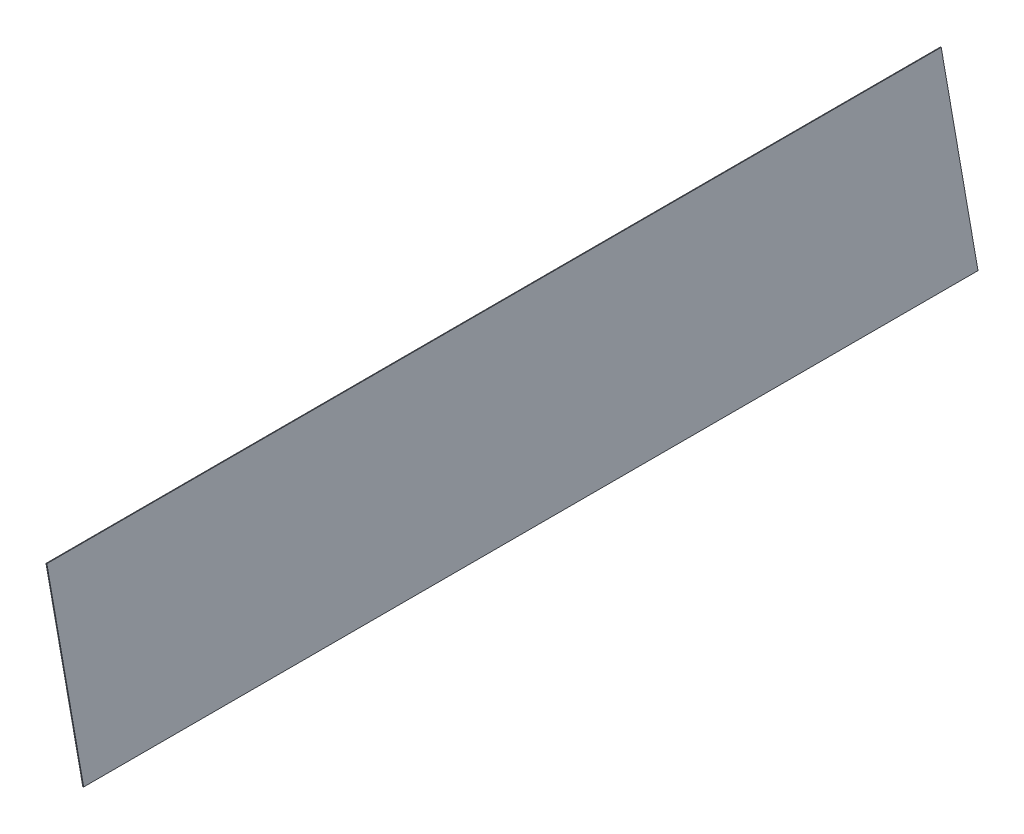
ISO-10303-21;
HEADER;
FILE_DESCRIPTION(('STEP AP214'),'2;1');
FILE_NAME('part.step','',(''),(''),'','','');
FILE_SCHEMA(('AUTOMOTIVE_DESIGN { 1 0 10303 214 1 1 1 1 }'));
ENDSEC;
DATA;
#1=APPLICATION_CONTEXT('core data for automotive mechanical design processes');
#2=APPLICATION_PROTOCOL_DEFINITION('international standard','automotive_design',2000,#1);
#3=PRODUCT_CONTEXT('',#1,'mechanical');
#4=PRODUCT('Part','Part','',(#3));
#5=PRODUCT_RELATED_PRODUCT_CATEGORY('part','',(#4));
#6=PRODUCT_DEFINITION_FORMATION('','',#4);
#7=PRODUCT_DEFINITION_CONTEXT('part definition',#1,'design');
#8=PRODUCT_DEFINITION('design','',#6,#7);
#9=PRODUCT_DEFINITION_SHAPE('','',#8);
#10=(LENGTH_UNIT() NAMED_UNIT(*) SI_UNIT(.MILLI.,.METRE.));
#11=(NAMED_UNIT(*) PLANE_ANGLE_UNIT() SI_UNIT($,.RADIAN.));
#12=(NAMED_UNIT(*) SI_UNIT($,.STERADIAN.) SOLID_ANGLE_UNIT());
#13=UNCERTAINTY_MEASURE_WITH_UNIT(LENGTH_MEASURE(1.E-05),#10,'distance_accuracy_value','');
#14=(GEOMETRIC_REPRESENTATION_CONTEXT(3) GLOBAL_UNCERTAINTY_ASSIGNED_CONTEXT((#13)) GLOBAL_UNIT_ASSIGNED_CONTEXT((#10,
#11,#12)) REPRESENTATION_CONTEXT('',''));
#15=CARTESIAN_POINT('',(0.,0.,0.));
#16=DIRECTION('',(0.,0.,1.));
#17=DIRECTION('',(1.,0.,0.));
#18=AXIS2_PLACEMENT_3D('',#15,#16,#17);
#19=CARTESIAN_POINT('',(44.52249256571,2.643035354187,-17.72));
#20=DIRECTION('',(-0.978598276565249,-0.205780011428526,0.));
#21=DIRECTION('',(0.,0.,1.));
#22=AXIS2_PLACEMENT_3D('',#19,#20,#21);
#23=PLANE('',#22);
#24=DIRECTION('',(0.,0.,-1.));
#25=VECTOR('',#24,1.);
#26=CARTESIAN_POINT('',(44.4977979765508,2.76047184483456,-6.8));
#27=LINE('',#26,#25);
#28=CARTESIAN_POINT('',(44.4977979765541,2.76047184483439,3.7));
#29=VERTEX_POINT('',#28);
#30=CARTESIAN_POINT('',(44.497797976553,2.76047184483441,-17.3));
#31=VERTEX_POINT('',#30);
#32=EDGE_CURVE('E21',#29,#31,#27,.T.);
#33=ORIENTED_EDGE('',*,*,#32,.F.);
#34=DIRECTION('',(0.205780011428484,-0.978598276565258,0.));
#35=VECTOR('',#34,1.);
#36=CARTESIAN_POINT('',(44.0656599525557,4.81552822562158,3.7));
#37=LINE('',#36,#35);
#38=CARTESIAN_POINT('',(43.6335219285566,6.87058460640943,3.7));
#39=VERTEX_POINT('',#38);
#40=EDGE_CURVE('E59',#39,#29,#37,.T.);
#41=ORIENTED_EDGE('',*,*,#40,.F.);
#42=DIRECTION('',(0.,0.,1.));
#43=VECTOR('',#42,1.);
#44=CARTESIAN_POINT('',(43.6335219285606,6.87058460640956,-6.8));
#45=LINE('',#44,#43);
#46=CARTESIAN_POINT('',(43.6335219285566,6.87058460640943,-17.3));
#47=VERTEX_POINT('',#46);
#48=EDGE_CURVE('E54',#47,#39,#45,.T.);
#49=ORIENTED_EDGE('',*,*,#48,.F.);
#50=DIRECTION('',(-0.205780011428484,0.978598276565258,0.));
#51=VECTOR('',#50,1.);
#52=CARTESIAN_POINT('',(44.0656599525557,4.81552822562158,-17.3));
#53=LINE('',#52,#51);
#54=EDGE_CURVE('E69',#31,#47,#53,.T.);
#55=ORIENTED_EDGE('',*,*,#54,.F.);
#56=EDGE_LOOP('',(#33,#41,#49,#55));
#57=FACE_BOUND('',#56,.T.);
#58=ADVANCED_FACE('F17',(#57),#23,.T.);
#59=CARTESIAN_POINT('',(44.5177613814,2.764669757067,-17.72));
#60=DIRECTION('',(0.205780011323712,-0.978598276587289,0.));
#61=DIRECTION('',(0.,0.,1.));
#62=AXIS2_PLACEMENT_3D('',#59,#60,#61);
#63=PLANE('',#62);
#64=DIRECTION('',(0.,0.,1.));
#65=VECTOR('',#64,1.);
#66=CARTESIAN_POINT('',(44.5173699420853,2.76458744506248,-6.8));
#67=LINE('',#66,#65);
#68=CARTESIAN_POINT('',(44.5173699420871,2.76458744506257,-17.3));
#69=VERTEX_POINT('',#68);
#70=CARTESIAN_POINT('',(44.5173699420871,2.76458744506257,3.7));
#71=VERTEX_POINT('',#70);
#72=EDGE_CURVE('E75',#69,#71,#67,.T.);
#73=ORIENTED_EDGE('',*,*,#72,.T.);
#74=DIRECTION('',(0.978598276557802,0.205780011463941,0.));
#75=VECTOR('',#74,1.);
#76=CARTESIAN_POINT('',(44.5075839593201,2.76252964494848,3.7));
#77=LINE('',#76,#75);
#78=EDGE_CURVE('E64',#29,#71,#77,.T.);
#79=ORIENTED_EDGE('',*,*,#78,.F.);
#80=ORIENTED_EDGE('',*,*,#32,.T.);
#81=DIRECTION('',(-0.978598276557806,-0.205780011463922,0.));
#82=VECTOR('',#81,1.);
#83=CARTESIAN_POINT('',(44.5075839593201,2.76252964494848,-17.3));
#84=LINE('',#83,#82);
#85=EDGE_CURVE('E80',#69,#31,#84,.T.);
#86=ORIENTED_EDGE('',*,*,#85,.F.);
#87=EDGE_LOOP('',(#73,#79,#80,#86));
#88=FACE_BOUND('',#87,.T.);
#89=ADVANCED_FACE('F74',(#88),#63,.T.);
#90=CARTESIAN_POINT('',(44.54245597055,2.64723326642,3.7));
#91=DIRECTION('',(0.,0.,1.));
#92=DIRECTION('',(-0.205780011426369,0.978598276565703,0.));
#93=AXIS2_PLACEMENT_3D('',#90,#91,#92);
#94=PLANE('',#93);
#95=ORIENTED_EDGE('',*,*,#40,.T.);
#96=ORIENTED_EDGE('',*,*,#78,.T.);
#97=DIRECTION('',(-0.205780011426372,0.978598276565702,0.));
#98=VECTOR('',#97,1.);
#99=CARTESIAN_POINT('',(44.08523191809,4.81964382585,3.70000000000001));
#100=LINE('',#99,#98);
#101=CARTESIAN_POINT('',(43.653093894093,6.87470020663771,3.7));
#102=VERTEX_POINT('',#101);
#103=EDGE_CURVE('E85',#71,#102,#100,.T.);
#104=ORIENTED_EDGE('',*,*,#103,.T.);
#105=DIRECTION('',(0.978598276566956,0.20578001142041,0.));
#106=VECTOR('',#105,1.);
#107=CARTESIAN_POINT('',(43.643307911325,6.8726424065235,3.7));
#108=LINE('',#107,#106);
#109=EDGE_CURVE('E66',#39,#102,#108,.T.);
#110=ORIENTED_EDGE('',*,*,#109,.F.);
#111=EDGE_LOOP('',(#95,#96,#104,#110));
#112=FACE_BOUND('',#111,.T.);
#113=ADVANCED_FACE('F61',(#112),#94,.T.);
#114=CARTESIAN_POINT('',(43.6534853334,6.874782518642,4.12));
#115=DIRECTION('',(-0.205780011420343,0.97859827656697,0.));
#116=DIRECTION('',(0.,0.,-1.));
#117=AXIS2_PLACEMENT_3D('',#114,#115,#116);
#118=PLANE('',#117);
#119=ORIENTED_EDGE('',*,*,#48,.T.);
#120=ORIENTED_EDGE('',*,*,#109,.T.);
#121=DIRECTION('',(0.,0.,-1.));
#122=VECTOR('',#121,1.);
#123=CARTESIAN_POINT('',(43.6530938940947,6.87470020663752,-6.8));
#124=LINE('',#123,#122);
#125=CARTESIAN_POINT('',(43.6530938940919,6.87470020663759,-17.3));
#126=VERTEX_POINT('',#125);
#127=EDGE_CURVE('E27',#102,#126,#124,.T.);
#128=ORIENTED_EDGE('',*,*,#127,.T.);
#129=DIRECTION('',(0.978598276577051,0.205780011372404,0.));
#130=VECTOR('',#129,1.);
#131=CARTESIAN_POINT('',(43.6433079113249,6.87264240652352,-17.3));
#132=LINE('',#131,#130);
#133=EDGE_CURVE('E35',#47,#126,#132,.T.);
#134=ORIENTED_EDGE('',*,*,#133,.F.);
#135=EDGE_LOOP('',(#119,#120,#128,#134));
#136=FACE_BOUND('',#135,.T.);
#137=ADVANCED_FACE('F89',(#136),#118,.T.);
#138=CARTESIAN_POINT('',(43.62879074425,6.99221900929,-17.3));
#139=DIRECTION('',(0.,0.,-1.));
#140=DIRECTION('',(0.205780011426369,-0.978598276565703,0.));
#141=AXIS2_PLACEMENT_3D('',#138,#139,#140);
#142=PLANE('',#141);
#143=ORIENTED_EDGE('',*,*,#54,.T.);
#144=ORIENTED_EDGE('',*,*,#133,.T.);
#145=DIRECTION('',(0.205780011426372,-0.978598276565702,0.));
#146=VECTOR('',#145,1.);
#147=CARTESIAN_POINT('',(44.08523191809,4.81964382585,-17.3));
#148=LINE('',#147,#146);
#149=EDGE_CURVE('E11',#126,#69,#148,.T.);
#150=ORIENTED_EDGE('',*,*,#149,.T.);
#151=ORIENTED_EDGE('',*,*,#85,.T.);
#152=EDGE_LOOP('',(#143,#144,#150,#151));
#153=FACE_BOUND('',#152,.T.);
#154=ADVANCED_FACE('F91',(#153),#142,.T.);
#155=CARTESIAN_POINT('',(44.54206453124,2.647150954415,-17.72));
#156=DIRECTION('',(-0.978598276565702,-0.205780011426372,0.));
#157=DIRECTION('',(0.,0.,1.));
#158=AXIS2_PLACEMENT_3D('',#155,#156,#157);
#159=PLANE('',#158);
#160=ORIENTED_EDGE('',*,*,#127,.F.);
#161=ORIENTED_EDGE('',*,*,#103,.F.);
#162=ORIENTED_EDGE('',*,*,#72,.F.);
#163=ORIENTED_EDGE('',*,*,#149,.F.);
#164=EDGE_LOOP('',(#160,#161,#162,#163));
#165=FACE_BOUND('',#164,.T.);
#166=ADVANCED_FACE('F19',(#165),#159,.F.);
#167=CLOSED_SHELL('',(#58,#89,#113,#137,#154,#166));
#168=MANIFOLD_SOLID_BREP('B1',#167);
#169=ADVANCED_BREP_SHAPE_REPRESENTATION('',(#18,#168),#14);
#170=SHAPE_DEFINITION_REPRESENTATION(#9,#169);
ENDSEC;
END-ISO-10303-21;
